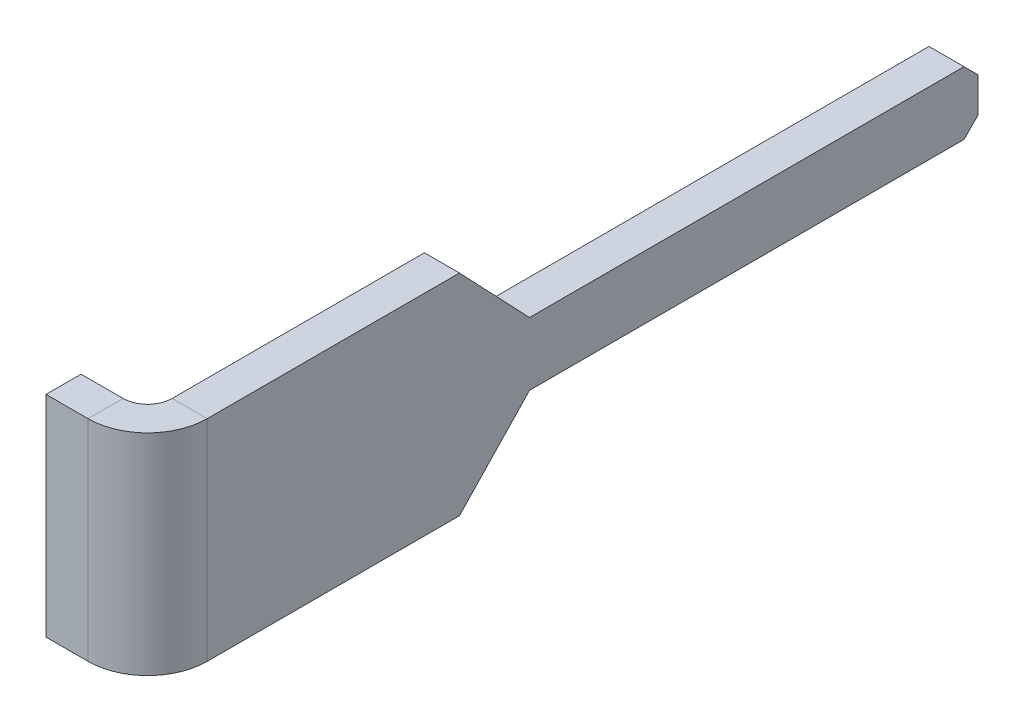
ISO-10303-21;
HEADER;
FILE_DESCRIPTION(('STEP AP214'),'2;1');
FILE_NAME('part.step','',(''),(''),'','','');
FILE_SCHEMA(('AUTOMOTIVE_DESIGN { 1 0 10303 214 1 1 1 1 }'));
ENDSEC;
DATA;
#1=APPLICATION_CONTEXT('core data for automotive mechanical design processes');
#2=APPLICATION_PROTOCOL_DEFINITION('international standard','automotive_design',2000,#1);
#3=PRODUCT_CONTEXT('',#1,'mechanical');
#4=PRODUCT('Part','Part','',(#3));
#5=PRODUCT_RELATED_PRODUCT_CATEGORY('part','',(#4));
#6=PRODUCT_DEFINITION_FORMATION('','',#4);
#7=PRODUCT_DEFINITION_CONTEXT('part definition',#1,'design');
#8=PRODUCT_DEFINITION('design','',#6,#7);
#9=PRODUCT_DEFINITION_SHAPE('','',#8);
#10=(LENGTH_UNIT() NAMED_UNIT(*) SI_UNIT(.MILLI.,.METRE.));
#11=(NAMED_UNIT(*) PLANE_ANGLE_UNIT() SI_UNIT($,.RADIAN.));
#12=(NAMED_UNIT(*) SI_UNIT($,.STERADIAN.) SOLID_ANGLE_UNIT());
#13=UNCERTAINTY_MEASURE_WITH_UNIT(LENGTH_MEASURE(1.E-05),#10,'distance_accuracy_value','');
#14=(GEOMETRIC_REPRESENTATION_CONTEXT(3) GLOBAL_UNCERTAINTY_ASSIGNED_CONTEXT((#13)) GLOBAL_UNIT_ASSIGNED_CONTEXT((#10,
#11,#12)) REPRESENTATION_CONTEXT('',''));
#15=CARTESIAN_POINT('',(0.,0.,0.));
#16=DIRECTION('',(0.,0.,1.));
#17=DIRECTION('',(1.,0.,0.));
#18=AXIS2_PLACEMENT_3D('',#15,#16,#17);
#19=CARTESIAN_POINT('',(3.925,-0.536916604931059,2.3));
#20=DIRECTION('',(0.,1.,0.));
#21=DIRECTION('',(0.,0.,1.));
#22=AXIS2_PLACEMENT_3D('',#19,#20,#21);
#23=PLANE('',#22);
#24=DIRECTION('',(1.,0.,0.));
#25=VECTOR('',#24,1.);
#26=CARTESIAN_POINT('',(3.425,-0.536916604931059,0.499999999999997));
#27=LINE('',#26,#25);
#28=CARTESIAN_POINT('',(3.675,-0.536916604931059,0.499999999999997));
#29=VERTEX_POINT('',#28);
#30=CARTESIAN_POINT('',(3.925,-0.536916604931059,0.499999999999997));
#31=VERTEX_POINT('',#30);
#32=EDGE_CURVE('E11',#29,#31,#27,.T.);
#33=ORIENTED_EDGE('',*,*,#32,.F.);
#34=DIRECTION('',(0.,0.,-1.));
#35=VECTOR('',#34,1.);
#36=CARTESIAN_POINT('',(3.675,-0.536916604931059,2.3));
#37=LINE('',#36,#35);
#38=CARTESIAN_POINT('',(3.675,-0.536916604931059,2.3));
#39=VERTEX_POINT('',#38);
#40=EDGE_CURVE('E24',#39,#29,#37,.T.);
#41=ORIENTED_EDGE('',*,*,#40,.F.);
#42=DIRECTION('',(1.,0.,0.));
#43=VECTOR('',#42,1.);
#44=CARTESIAN_POINT('',(3.925,-0.536916604931059,2.3));
#45=LINE('',#44,#43);
#46=CARTESIAN_POINT('',(3.925,-0.536916604931059,2.3));
#47=VERTEX_POINT('',#46);
#48=EDGE_CURVE('E229',#39,#47,#45,.T.);
#49=ORIENTED_EDGE('',*,*,#48,.T.);
#50=DIRECTION('',(0.,0.,-1.));
#51=VECTOR('',#50,1.);
#52=CARTESIAN_POINT('',(3.925,-0.536916604931059,2.3));
#53=LINE('',#52,#51);
#54=EDGE_CURVE('E227',#47,#31,#53,.T.);
#55=ORIENTED_EDGE('',*,*,#54,.T.);
#56=EDGE_LOOP('',(#33,#41,#49,#55));
#57=FACE_BOUND('',#56,.T.);
#58=ADVANCED_FACE('F17',(#57),#23,.T.);
#59=CARTESIAN_POINT('',(3.925,-0.536916604931059,2.3));
#60=DIRECTION('',(1.,0.,0.));
#61=DIRECTION('',(0.,1.,0.));
#62=AXIS2_PLACEMENT_3D('',#59,#60,#61);
#63=PLANE('',#62);
#64=DIRECTION('',(0.,-0.724137931034481,0.689655172413795));
#65=VECTOR('',#64,1.);
#66=CARTESIAN_POINT('',(3.925,-1.51191660493106,0.));
#67=LINE('',#66,#65);
#68=CARTESIAN_POINT('',(3.925,-1.51191660493106,0.));
#69=VERTEX_POINT('',#68);
#70=CARTESIAN_POINT('',(3.925,-2.03691660493106,0.499999999999997));
#71=VERTEX_POINT('',#70);
#72=EDGE_CURVE('E225',#69,#71,#67,.T.);
#73=ORIENTED_EDGE('',*,*,#72,.F.);
#74=DIRECTION('',(0.,0.,1.));
#75=VECTOR('',#74,1.);
#76=CARTESIAN_POINT('',(3.925,-1.51191660493106,0.));
#77=LINE('',#76,#75);
#78=CARTESIAN_POINT('',(3.925,-1.51191660493106,-3.1));
#79=VERTEX_POINT('',#78);
#80=EDGE_CURVE('E222',#79,#69,#77,.T.);
#81=ORIENTED_EDGE('',*,*,#80,.F.);
#82=DIRECTION('',(0.,-0.707106781186548,0.707106781186548));
#83=VECTOR('',#82,1.);
#84=CARTESIAN_POINT('',(3.925,-1.41191660493106,-3.2));
#85=LINE('',#84,#83);
#86=CARTESIAN_POINT('',(3.925,-1.41191660493106,-3.2));
#87=VERTEX_POINT('',#86);
#88=EDGE_CURVE('E219',#87,#79,#85,.T.);
#89=ORIENTED_EDGE('',*,*,#88,.F.);
#90=DIRECTION('',(0.,-1.,0.));
#91=VECTOR('',#90,1.);
#92=CARTESIAN_POINT('',(3.925,-0.53691660493106,-3.2));
#93=LINE('',#92,#91);
#94=CARTESIAN_POINT('',(3.925,-1.16191660493106,-3.2));
#95=VERTEX_POINT('',#94);
#96=EDGE_CURVE('E216',#95,#87,#93,.T.);
#97=ORIENTED_EDGE('',*,*,#96,.F.);
#98=DIRECTION('',(0.,-0.707106781186546,-0.707106781186549));
#99=VECTOR('',#98,1.);
#100=CARTESIAN_POINT('',(3.925,-1.06191660493106,-3.1));
#101=LINE('',#100,#99);
#102=CARTESIAN_POINT('',(3.925,-1.06191660493106,-3.1));
#103=VERTEX_POINT('',#102);
#104=EDGE_CURVE('E213',#103,#95,#101,.T.);
#105=ORIENTED_EDGE('',*,*,#104,.F.);
#106=DIRECTION('',(0.,0.,-1.));
#107=VECTOR('',#106,1.);
#108=CARTESIAN_POINT('',(3.925,-1.06191660493106,0.));
#109=LINE('',#108,#107);
#110=CARTESIAN_POINT('',(3.925,-1.06191660493106,0.));
#111=VERTEX_POINT('',#110);
#112=EDGE_CURVE('E210',#111,#103,#109,.T.);
#113=ORIENTED_EDGE('',*,*,#112,.F.);
#114=DIRECTION('',(0.,-0.724137931034485,-0.689655172413791));
#115=VECTOR('',#114,1.);
#116=CARTESIAN_POINT('',(3.925,-1.06191660493106,0.));
#117=LINE('',#116,#115);
#118=EDGE_CURVE('E208',#31,#111,#117,.T.);
#119=ORIENTED_EDGE('',*,*,#118,.F.);
#120=ORIENTED_EDGE('',*,*,#54,.F.);
#121=DIRECTION('',(0.,-1.,0.));
#122=VECTOR('',#121,1.);
#123=CARTESIAN_POINT('',(3.925,-0.536916604931059,2.3));
#124=LINE('',#123,#122);
#125=CARTESIAN_POINT('',(3.925,-2.03691660493106,2.3));
#126=VERTEX_POINT('',#125);
#127=EDGE_CURVE('E206',#47,#126,#124,.T.);
#128=ORIENTED_EDGE('',*,*,#127,.T.);
#129=DIRECTION('',(0.,0.,-1.));
#130=VECTOR('',#129,1.);
#131=CARTESIAN_POINT('',(3.925,-2.03691660493106,2.3));
#132=LINE('',#131,#130);
#133=EDGE_CURVE('E203',#126,#71,#132,.T.);
#134=ORIENTED_EDGE('',*,*,#133,.T.);
#135=EDGE_LOOP('',(#73,#81,#89,#97,#105,#113,#119,#120,#128,#134));
#136=FACE_BOUND('',#135,.T.);
#137=ADVANCED_FACE('F262',(#136),#63,.T.);
#138=CARTESIAN_POINT('',(3.925,-2.03691660493106,2.3));
#139=DIRECTION('',(0.,-1.,0.));
#140=DIRECTION('',(0.,0.,-1.));
#141=AXIS2_PLACEMENT_3D('',#138,#139,#140);
#142=PLANE('',#141);
#143=DIRECTION('',(1.,0.,0.));
#144=VECTOR('',#143,1.);
#145=CARTESIAN_POINT('',(3.425,-2.03691660493106,0.499999999999997));
#146=LINE('',#145,#144);
#147=CARTESIAN_POINT('',(3.675,-2.03691660493106,0.499999999999997));
#148=VERTEX_POINT('',#147);
#149=EDGE_CURVE('E200',#148,#71,#146,.T.);
#150=ORIENTED_EDGE('',*,*,#149,.T.);
#151=ORIENTED_EDGE('',*,*,#133,.F.);
#152=DIRECTION('',(-1.,0.,0.));
#153=VECTOR('',#152,1.);
#154=CARTESIAN_POINT('',(3.925,-2.03691660493106,2.3));
#155=LINE('',#154,#153);
#156=CARTESIAN_POINT('',(3.675,-2.03691660493106,2.3));
#157=VERTEX_POINT('',#156);
#158=EDGE_CURVE('E198',#126,#157,#155,.T.);
#159=ORIENTED_EDGE('',*,*,#158,.T.);
#160=DIRECTION('',(0.,0.,-1.));
#161=VECTOR('',#160,1.);
#162=CARTESIAN_POINT('',(3.675,-2.03691660493106,2.3));
#163=LINE('',#162,#161);
#164=EDGE_CURVE('E195',#157,#148,#163,.T.);
#165=ORIENTED_EDGE('',*,*,#164,.T.);
#166=EDGE_LOOP('',(#150,#151,#159,#165));
#167=FACE_BOUND('',#166,.T.);
#168=ADVANCED_FACE('F274',(#167),#142,.T.);
#169=CARTESIAN_POINT('',(3.675,-0.536916604931059,2.3));
#170=DIRECTION('',(-1.,0.,0.));
#171=DIRECTION('',(0.,0.,1.));
#172=AXIS2_PLACEMENT_3D('',#169,#170,#171);
#173=PLANE('',#172);
#174=DIRECTION('',(0.,0.724137931034481,-0.689655172413795));
#175=VECTOR('',#174,1.);
#176=CARTESIAN_POINT('',(3.675,-2.14928283560883,0.607015457788349));
#177=LINE('',#176,#175);
#178=CARTESIAN_POINT('',(3.675,-1.51191660493106,0.));
#179=VERTEX_POINT('',#178);
#180=EDGE_CURVE('E193',#148,#179,#177,.T.);
#181=ORIENTED_EDGE('',*,*,#180,.F.);
#182=ORIENTED_EDGE('',*,*,#164,.F.);
#183=DIRECTION('',(0.,1.,0.));
#184=VECTOR('',#183,1.);
#185=CARTESIAN_POINT('',(3.675,-0.536916604931059,2.3));
#186=LINE('',#185,#184);
#187=EDGE_CURVE('E190',#157,#39,#186,.T.);
#188=ORIENTED_EDGE('',*,*,#187,.T.);
#189=ORIENTED_EDGE('',*,*,#40,.T.);
#190=DIRECTION('',(0.,0.724137931034485,0.689655172413791));
#191=VECTOR('',#190,1.);
#192=CARTESIAN_POINT('',(3.675,0.362013240491058,1.35612366230677));
#193=LINE('',#192,#191);
#194=CARTESIAN_POINT('',(3.675,-1.06191660493106,0.));
#195=VERTEX_POINT('',#194);
#196=EDGE_CURVE('E188',#195,#29,#193,.T.);
#197=ORIENTED_EDGE('',*,*,#196,.F.);
#198=DIRECTION('',(0.,0.,1.));
#199=VECTOR('',#198,1.);
#200=CARTESIAN_POINT('',(3.675,-1.06191660493106,2.3));
#201=LINE('',#200,#199);
#202=CARTESIAN_POINT('',(3.675,-1.06191660493106,-3.1));
#203=VERTEX_POINT('',#202);
#204=EDGE_CURVE('E185',#203,#195,#201,.T.);
#205=ORIENTED_EDGE('',*,*,#204,.F.);
#206=DIRECTION('',(0.,0.707106781186546,0.707106781186549));
#207=VECTOR('',#206,1.);
#208=CARTESIAN_POINT('',(3.675,1.90058339506894,-0.137499999999989));
#209=LINE('',#208,#207);
#210=CARTESIAN_POINT('',(3.675,-1.16191660493106,-3.2));
#211=VERTEX_POINT('',#210);
#212=EDGE_CURVE('E182',#211,#203,#209,.T.);
#213=ORIENTED_EDGE('',*,*,#212,.F.);
#214=DIRECTION('',(0.,1.,0.));
#215=VECTOR('',#214,1.);
#216=CARTESIAN_POINT('',(3.675,-0.53691660493106,-3.2));
#217=LINE('',#216,#215);
#218=CARTESIAN_POINT('',(3.675,-1.41191660493106,-3.2));
#219=VERTEX_POINT('',#218);
#220=EDGE_CURVE('E179',#219,#211,#217,.T.);
#221=ORIENTED_EDGE('',*,*,#220,.F.);
#222=DIRECTION('',(0.,0.707106781186548,-0.707106781186548));
#223=VECTOR('',#222,1.);
#224=CARTESIAN_POINT('',(3.675,-3.72441660493106,-0.887500000000004));
#225=LINE('',#224,#223);
#226=CARTESIAN_POINT('',(3.675,-1.51191660493106,-3.1));
#227=VERTEX_POINT('',#226);
#228=EDGE_CURVE('E176',#227,#219,#225,.T.);
#229=ORIENTED_EDGE('',*,*,#228,.F.);
#230=DIRECTION('',(0.,0.,-1.));
#231=VECTOR('',#230,1.);
#232=CARTESIAN_POINT('',(3.675,-1.51191660493106,2.3));
#233=LINE('',#232,#231);
#234=EDGE_CURVE('E173',#179,#227,#233,.T.);
#235=ORIENTED_EDGE('',*,*,#234,.F.);
#236=EDGE_LOOP('',(#181,#182,#188,#189,#197,#205,#213,#221,#229,#235));
#237=FACE_BOUND('',#236,.T.);
#238=ADVANCED_FACE('F232',(#237),#173,.T.);
#239=CARTESIAN_POINT('',(3.5,-0.536916604931059,2.725));
#240=DIRECTION('',(0.,1.,0.));
#241=DIRECTION('',(0.,0.,1.));
#242=AXIS2_PLACEMENT_3D('',#239,#240,#241);
#243=PLANE('',#242);
#244=DIRECTION('',(0.,0.,1.));
#245=VECTOR('',#244,1.);
#246=CARTESIAN_POINT('',(3.5,-0.536916604931059,2.725));
#247=LINE('',#246,#245);
#248=CARTESIAN_POINT('',(3.5,-0.536916604931059,2.475));
#249=VERTEX_POINT('',#248);
#250=CARTESIAN_POINT('',(3.5,-0.536916604931059,2.725));
#251=VERTEX_POINT('',#250);
#252=EDGE_CURVE('E171',#249,#251,#247,.T.);
#253=ORIENTED_EDGE('',*,*,#252,.T.);
#254=CARTESIAN_POINT('',(3.5,-0.536916604931059,2.3));
#255=DIRECTION('',(0.,1.,0.));
#256=DIRECTION('',(0.,0.,1.));
#257=AXIS2_PLACEMENT_3D('',#254,#255,#256);
#258=CIRCLE('',#257,0.425000000000003);
#259=EDGE_CURVE('E168',#251,#47,#258,.T.);
#260=ORIENTED_EDGE('',*,*,#259,.T.);
#261=ORIENTED_EDGE('',*,*,#48,.F.);
#262=CARTESIAN_POINT('',(3.5,-0.536916604931059,2.3));
#263=DIRECTION('',(0.,1.,0.));
#264=DIRECTION('',(0.,0.,1.));
#265=AXIS2_PLACEMENT_3D('',#262,#263,#264);
#266=CIRCLE('',#265,0.175000000000002);
#267=EDGE_CURVE('E165',#249,#39,#266,.T.);
#268=ORIENTED_EDGE('',*,*,#267,.F.);
#269=EDGE_LOOP('',(#253,#260,#261,#268));
#270=FACE_BOUND('',#269,.T.);
#271=ADVANCED_FACE('F313',(#270),#243,.T.);
#272=CARTESIAN_POINT('',(3.5,-0.38,2.3));
#273=DIRECTION('',(0.,1.,0.));
#274=DIRECTION('',(0.,0.,1.));
#275=AXIS2_PLACEMENT_3D('',#272,#273,#274);
#276=CYLINDRICAL_SURFACE('',#275,0.425000000000003);
#277=DIRECTION('',(0.,-1.,0.));
#278=VECTOR('',#277,1.);
#279=CARTESIAN_POINT('',(3.5,-0.536916604931059,2.725));
#280=LINE('',#279,#278);
#281=CARTESIAN_POINT('',(3.5,-2.03691660493106,2.725));
#282=VERTEX_POINT('',#281);
#283=EDGE_CURVE('E163',#251,#282,#280,.T.);
#284=ORIENTED_EDGE('',*,*,#283,.T.);
#285=CARTESIAN_POINT('',(3.5,-2.03691660493106,2.3));
#286=DIRECTION('',(0.,1.,0.));
#287=DIRECTION('',(0.,0.,1.));
#288=AXIS2_PLACEMENT_3D('',#285,#286,#287);
#289=CIRCLE('',#288,0.425000000000002);
#290=EDGE_CURVE('E160',#282,#126,#289,.T.);
#291=ORIENTED_EDGE('',*,*,#290,.T.);
#292=ORIENTED_EDGE('',*,*,#127,.F.);
#293=ORIENTED_EDGE('',*,*,#259,.F.);
#294=EDGE_LOOP('',(#284,#291,#292,#293));
#295=FACE_BOUND('',#294,.T.);
#296=ADVANCED_FACE('F286',(#295),#276,.T.);
#297=CARTESIAN_POINT('',(3.5,-2.03691660493106,2.725));
#298=DIRECTION('',(0.,-1.,0.));
#299=DIRECTION('',(0.,0.,-1.));
#300=AXIS2_PLACEMENT_3D('',#297,#298,#299);
#301=PLANE('',#300);
#302=DIRECTION('',(0.,0.,-1.));
#303=VECTOR('',#302,1.);
#304=CARTESIAN_POINT('',(3.5,-2.03691660493106,2.725));
#305=LINE('',#304,#303);
#306=CARTESIAN_POINT('',(3.5,-2.03691660493106,2.475));
#307=VERTEX_POINT('',#306);
#308=EDGE_CURVE('E132',#282,#307,#305,.T.);
#309=ORIENTED_EDGE('',*,*,#308,.T.);
#310=CARTESIAN_POINT('',(3.5,-2.03691660493106,2.3));
#311=DIRECTION('',(0.,1.,0.));
#312=DIRECTION('',(0.,0.,1.));
#313=AXIS2_PLACEMENT_3D('',#310,#311,#312);
#314=CIRCLE('',#313,0.175000000000002);
#315=EDGE_CURVE('E156',#307,#157,#314,.T.);
#316=ORIENTED_EDGE('',*,*,#315,.T.);
#317=ORIENTED_EDGE('',*,*,#158,.F.);
#318=ORIENTED_EDGE('',*,*,#290,.F.);
#319=EDGE_LOOP('',(#309,#316,#317,#318));
#320=FACE_BOUND('',#319,.T.);
#321=ADVANCED_FACE('F282',(#320),#301,.T.);
#322=CARTESIAN_POINT('',(3.5,-0.38,2.3));
#323=DIRECTION('',(0.,1.,0.));
#324=DIRECTION('',(0.,0.,1.));
#325=AXIS2_PLACEMENT_3D('',#322,#323,#324);
#326=CYLINDRICAL_SURFACE('',#325,0.175000000000002);
#327=DIRECTION('',(0.,1.,0.));
#328=VECTOR('',#327,1.);
#329=CARTESIAN_POINT('',(3.5,-0.536916604931059,2.475));
#330=LINE('',#329,#328);
#331=EDGE_CURVE('E153',#307,#249,#330,.T.);
#332=ORIENTED_EDGE('',*,*,#331,.T.);
#333=ORIENTED_EDGE('',*,*,#267,.T.);
#334=ORIENTED_EDGE('',*,*,#187,.F.);
#335=ORIENTED_EDGE('',*,*,#315,.F.);
#336=EDGE_LOOP('',(#332,#333,#334,#335));
#337=FACE_BOUND('',#336,.T.);
#338=ADVANCED_FACE('F278',(#337),#326,.F.);
#339=CARTESIAN_POINT('',(3.5,-0.536916604931059,2.475));
#340=DIRECTION('',(0.,0.,1.));
#341=DIRECTION('',(1.,0.,0.));
#342=AXIS2_PLACEMENT_3D('',#339,#340,#341);
#343=PLANE('',#342);
#344=DIRECTION('',(0.,1.,0.));
#345=VECTOR('',#344,1.);
#346=CARTESIAN_POINT('',(3.2,-0.536916604931059,2.475));
#347=LINE('',#346,#345);
#348=CARTESIAN_POINT('',(3.2,-2.03691660493106,2.475));
#349=VERTEX_POINT('',#348);
#350=CARTESIAN_POINT('',(3.2,-0.536916604931059,2.475));
#351=VERTEX_POINT('',#350);
#352=EDGE_CURVE('E135',#349,#351,#347,.T.);
#353=ORIENTED_EDGE('',*,*,#352,.T.);
#354=DIRECTION('',(-1.,0.,0.));
#355=VECTOR('',#354,1.);
#356=CARTESIAN_POINT('',(3.5,-0.536916604931059,2.475));
#357=LINE('',#356,#355);
#358=EDGE_CURVE('E149',#249,#351,#357,.T.);
#359=ORIENTED_EDGE('',*,*,#358,.F.);
#360=ORIENTED_EDGE('',*,*,#331,.F.);
#361=DIRECTION('',(-1.,0.,0.));
#362=VECTOR('',#361,1.);
#363=CARTESIAN_POINT('',(3.5,-2.03691660493106,2.475));
#364=LINE('',#363,#362);
#365=EDGE_CURVE('E147',#307,#349,#364,.T.);
#366=ORIENTED_EDGE('',*,*,#365,.T.);
#367=EDGE_LOOP('',(#353,#359,#360,#366));
#368=FACE_BOUND('',#367,.T.);
#369=ADVANCED_FACE('F292',(#368),#343,.F.);
#370=CARTESIAN_POINT('',(3.5,-0.536916604931059,2.725));
#371=DIRECTION('',(0.,-1.,0.));
#372=DIRECTION('',(0.,0.,-1.));
#373=AXIS2_PLACEMENT_3D('',#370,#371,#372);
#374=PLANE('',#373);
#375=DIRECTION('',(0.,0.,1.));
#376=VECTOR('',#375,1.);
#377=CARTESIAN_POINT('',(3.2,-0.536916604931059,2.725));
#378=LINE('',#377,#376);
#379=CARTESIAN_POINT('',(3.2,-0.536916604931059,2.725));
#380=VERTEX_POINT('',#379);
#381=EDGE_CURVE('E145',#351,#380,#378,.T.);
#382=ORIENTED_EDGE('',*,*,#381,.T.);
#383=DIRECTION('',(-1.,0.,0.));
#384=VECTOR('',#383,1.);
#385=CARTESIAN_POINT('',(3.5,-0.536916604931059,2.725));
#386=LINE('',#385,#384);
#387=EDGE_CURVE('E121',#251,#380,#386,.T.);
#388=ORIENTED_EDGE('',*,*,#387,.F.);
#389=ORIENTED_EDGE('',*,*,#252,.F.);
#390=ORIENTED_EDGE('',*,*,#358,.T.);
#391=EDGE_LOOP('',(#382,#388,#389,#390));
#392=FACE_BOUND('',#391,.T.);
#393=ADVANCED_FACE('F289',(#392),#374,.F.);
#394=CARTESIAN_POINT('',(3.5,-0.536916604931059,2.725));
#395=DIRECTION('',(0.,0.,-1.));
#396=DIRECTION('',(0.,1.,0.));
#397=AXIS2_PLACEMENT_3D('',#394,#395,#396);
#398=PLANE('',#397);
#399=DIRECTION('',(0.,-1.,0.));
#400=VECTOR('',#399,1.);
#401=CARTESIAN_POINT('',(3.2,-0.536916604931059,2.725));
#402=LINE('',#401,#400);
#403=CARTESIAN_POINT('',(3.2,-2.03691660493106,2.725));
#404=VERTEX_POINT('',#403);
#405=EDGE_CURVE('E115',#380,#404,#402,.T.);
#406=ORIENTED_EDGE('',*,*,#405,.T.);
#407=DIRECTION('',(-1.,0.,0.));
#408=VECTOR('',#407,1.);
#409=CARTESIAN_POINT('',(3.5,-2.03691660493106,2.725));
#410=LINE('',#409,#408);
#411=EDGE_CURVE('E119',#282,#404,#410,.T.);
#412=ORIENTED_EDGE('',*,*,#411,.F.);
#413=ORIENTED_EDGE('',*,*,#283,.F.);
#414=ORIENTED_EDGE('',*,*,#387,.T.);
#415=EDGE_LOOP('',(#406,#412,#413,#414));
#416=FACE_BOUND('',#415,.T.);
#417=ADVANCED_FACE('F117',(#416),#398,.F.);
#418=CARTESIAN_POINT('',(3.5,-2.03691660493106,2.725));
#419=DIRECTION('',(0.,1.,0.));
#420=DIRECTION('',(0.,0.,1.));
#421=AXIS2_PLACEMENT_3D('',#418,#419,#420);
#422=PLANE('',#421);
#423=DIRECTION('',(0.,0.,-1.));
#424=VECTOR('',#423,1.);
#425=CARTESIAN_POINT('',(3.2,-2.03691660493106,2.725));
#426=LINE('',#425,#424);
#427=EDGE_CURVE('E131',#404,#349,#426,.T.);
#428=ORIENTED_EDGE('',*,*,#427,.T.);
#429=ORIENTED_EDGE('',*,*,#365,.F.);
#430=ORIENTED_EDGE('',*,*,#308,.F.);
#431=ORIENTED_EDGE('',*,*,#411,.T.);
#432=EDGE_LOOP('',(#428,#429,#430,#431));
#433=FACE_BOUND('',#432,.T.);
#434=ADVANCED_FACE('F129',(#433),#422,.F.);
#435=CARTESIAN_POINT('',(1.2,-5.08,-3.2));
#436=DIRECTION('',(0.,0.,-1.));
#437=DIRECTION('',(-1.,0.,0.));
#438=AXIS2_PLACEMENT_3D('',#435,#436,#437);
#439=PLANE('',#438);
#440=DIRECTION('',(1.,0.,0.));
#441=VECTOR('',#440,1.);
#442=CARTESIAN_POINT('',(1.19999999999999,-1.41191660493106,-3.2));
#443=LINE('',#442,#441);
#444=EDGE_CURVE('E137',#219,#87,#443,.T.);
#445=ORIENTED_EDGE('',*,*,#444,.F.);
#446=ORIENTED_EDGE('',*,*,#220,.T.);
#447=DIRECTION('',(-1.,0.,0.));
#448=VECTOR('',#447,1.);
#449=CARTESIAN_POINT('',(1.20000000000001,-1.16191660493106,-3.2));
#450=LINE('',#449,#448);
#451=EDGE_CURVE('E140',#95,#211,#450,.T.);
#452=ORIENTED_EDGE('',*,*,#451,.F.);
#453=ORIENTED_EDGE('',*,*,#96,.T.);
#454=EDGE_LOOP('',(#445,#446,#452,#453));
#455=FACE_BOUND('',#454,.T.);
#456=ADVANCED_FACE('F265',(#455),#439,.T.);
#457=CARTESIAN_POINT('',(3.2,-5.08,0.));
#458=DIRECTION('',(1.,0.,0.));
#459=DIRECTION('',(0.,0.,-1.));
#460=AXIS2_PLACEMENT_3D('',#457,#458,#459);
#461=PLANE('',#460);
#462=ORIENTED_EDGE('',*,*,#352,.F.);
#463=ORIENTED_EDGE('',*,*,#427,.F.);
#464=ORIENTED_EDGE('',*,*,#405,.F.);
#465=ORIENTED_EDGE('',*,*,#381,.F.);
#466=EDGE_LOOP('',(#462,#463,#464,#465));
#467=FACE_BOUND('',#466,.T.);
#468=ADVANCED_FACE('F134',(#467),#461,.F.);
#469=CARTESIAN_POINT('',(3.425,-1.06191660493106,0.));
#470=DIRECTION('',(0.,-0.689655172413791,0.724137931034485));
#471=DIRECTION('',(0.,-0.724137931034485,-0.689655172413791));
#472=AXIS2_PLACEMENT_3D('',#469,#470,#471);
#473=PLANE('',#472);
#474=ORIENTED_EDGE('',*,*,#196,.T.);
#475=ORIENTED_EDGE('',*,*,#32,.T.);
#476=ORIENTED_EDGE('',*,*,#118,.T.);
#477=DIRECTION('',(1.,0.,0.));
#478=VECTOR('',#477,1.);
#479=CARTESIAN_POINT('',(3.425,-1.06191660493106,0.));
#480=LINE('',#479,#478);
#481=EDGE_CURVE('E239',#195,#111,#480,.T.);
#482=ORIENTED_EDGE('',*,*,#481,.F.);
#483=EDGE_LOOP('',(#474,#475,#476,#482));
#484=FACE_BOUND('',#483,.T.);
#485=ADVANCED_FACE('F237',(#484),#473,.F.);
#486=CARTESIAN_POINT('',(3.425,-1.06191660493106,-3.1));
#487=DIRECTION('',(0.,-0.707106781186549,0.707106781186546));
#488=DIRECTION('',(0.,-0.707106781186546,-0.707106781186549));
#489=AXIS2_PLACEMENT_3D('',#486,#487,#488);
#490=PLANE('',#489);
#491=ORIENTED_EDGE('',*,*,#212,.T.);
#492=DIRECTION('',(1.,0.,0.));
#493=VECTOR('',#492,1.);
#494=CARTESIAN_POINT('',(3.425,-1.06191660493106,-3.1));
#495=LINE('',#494,#493);
#496=EDGE_CURVE('E242',#203,#103,#495,.T.);
#497=ORIENTED_EDGE('',*,*,#496,.T.);
#498=ORIENTED_EDGE('',*,*,#104,.T.);
#499=ORIENTED_EDGE('',*,*,#451,.T.);
#500=EDGE_LOOP('',(#491,#497,#498,#499));
#501=FACE_BOUND('',#500,.T.);
#502=ADVANCED_FACE('F267',(#501),#490,.F.);
#503=CARTESIAN_POINT('',(3.425,-1.06191660493106,0.));
#504=DIRECTION('',(0.,-1.,0.));
#505=DIRECTION('',(0.,0.,-1.));
#506=AXIS2_PLACEMENT_3D('',#503,#504,#505);
#507=PLANE('',#506);
#508=ORIENTED_EDGE('',*,*,#204,.T.);
#509=ORIENTED_EDGE('',*,*,#481,.T.);
#510=ORIENTED_EDGE('',*,*,#112,.T.);
#511=ORIENTED_EDGE('',*,*,#496,.F.);
#512=EDGE_LOOP('',(#508,#509,#510,#511));
#513=FACE_BOUND('',#512,.T.);
#514=ADVANCED_FACE('F269',(#513),#507,.F.);
#515=CARTESIAN_POINT('',(3.425,-1.51191660493106,0.));
#516=DIRECTION('',(0.,0.689655172413795,0.724137931034481));
#517=DIRECTION('',(0.,-0.724137931034481,0.689655172413795));
#518=AXIS2_PLACEMENT_3D('',#515,#516,#517);
#519=PLANE('',#518);
#520=ORIENTED_EDGE('',*,*,#180,.T.);
#521=DIRECTION('',(1.,0.,0.));
#522=VECTOR('',#521,1.);
#523=CARTESIAN_POINT('',(3.425,-1.51191660493106,0.));
#524=LINE('',#523,#522);
#525=EDGE_CURVE('E246',#179,#69,#524,.T.);
#526=ORIENTED_EDGE('',*,*,#525,.T.);
#527=ORIENTED_EDGE('',*,*,#72,.T.);
#528=ORIENTED_EDGE('',*,*,#149,.F.);
#529=EDGE_LOOP('',(#520,#526,#527,#528));
#530=FACE_BOUND('',#529,.T.);
#531=ADVANCED_FACE('F271',(#530),#519,.F.);
#532=CARTESIAN_POINT('',(3.425,-1.51191660493106,0.));
#533=DIRECTION('',(0.,1.,0.));
#534=DIRECTION('',(0.,0.,1.));
#535=AXIS2_PLACEMENT_3D('',#532,#533,#534);
#536=PLANE('',#535);
#537=ORIENTED_EDGE('',*,*,#234,.T.);
#538=DIRECTION('',(1.,0.,0.));
#539=VECTOR('',#538,1.);
#540=CARTESIAN_POINT('',(3.425,-1.51191660493106,-3.1));
#541=LINE('',#540,#539);
#542=EDGE_CURVE('E251',#227,#79,#541,.T.);
#543=ORIENTED_EDGE('',*,*,#542,.T.);
#544=ORIENTED_EDGE('',*,*,#80,.T.);
#545=ORIENTED_EDGE('',*,*,#525,.F.);
#546=EDGE_LOOP('',(#537,#543,#544,#545));
#547=FACE_BOUND('',#546,.T.);
#548=ADVANCED_FACE('F255',(#547),#536,.F.);
#549=CARTESIAN_POINT('',(3.425,-1.41191660493106,-3.2));
#550=DIRECTION('',(0.,0.707106781186548,0.707106781186548));
#551=DIRECTION('',(0.,-0.707106781186548,0.707106781186548));
#552=AXIS2_PLACEMENT_3D('',#549,#550,#551);
#553=PLANE('',#552);
#554=ORIENTED_EDGE('',*,*,#228,.T.);
#555=ORIENTED_EDGE('',*,*,#444,.T.);
#556=ORIENTED_EDGE('',*,*,#88,.T.);
#557=ORIENTED_EDGE('',*,*,#542,.F.);
#558=EDGE_LOOP('',(#554,#555,#556,#557));
#559=FACE_BOUND('',#558,.T.);
#560=ADVANCED_FACE('F259',(#559),#553,.F.);
#561=CLOSED_SHELL('',(#58,#137,#168,#238,#271,#296,#321,#338,#369,#393,#417,#434,#456,#468,#485,
#502,#514,#531,#548,#560));
#562=MANIFOLD_SOLID_BREP('B1',#561);
#563=ADVANCED_BREP_SHAPE_REPRESENTATION('',(#18,#562),#14);
#564=SHAPE_DEFINITION_REPRESENTATION(#9,#563);
ENDSEC;
END-ISO-10303-21;
